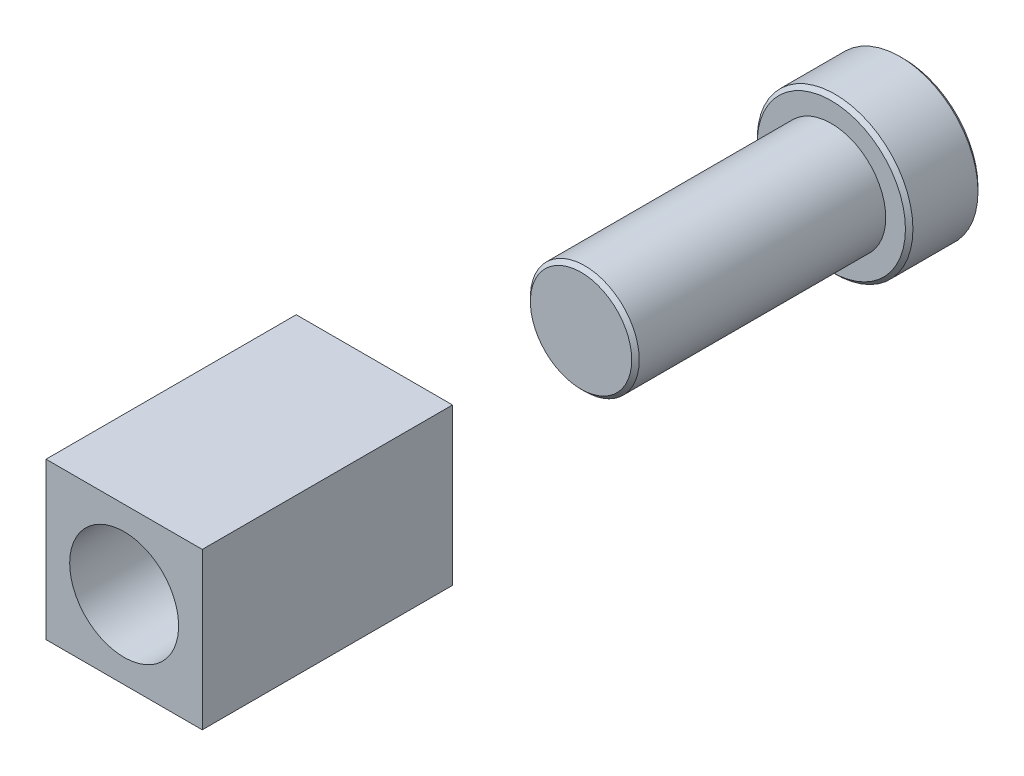
ISO-10303-21;
HEADER;
FILE_DESCRIPTION(('STEP AP214'),'2;1');
FILE_NAME('part.step','',(''),(''),'','','');
FILE_SCHEMA(('AUTOMOTIVE_DESIGN { 1 0 10303 214 1 1 1 1 }'));
ENDSEC;
DATA;
#1=APPLICATION_CONTEXT('core data for automotive mechanical design processes');
#2=APPLICATION_PROTOCOL_DEFINITION('international standard','automotive_design',2000,#1);
#3=PRODUCT_CONTEXT('',#1,'mechanical');
#4=PRODUCT('Part','Part','',(#3));
#5=PRODUCT_RELATED_PRODUCT_CATEGORY('part','',(#4));
#6=PRODUCT_DEFINITION_FORMATION('','',#4);
#7=PRODUCT_DEFINITION_CONTEXT('part definition',#1,'design');
#8=PRODUCT_DEFINITION('design','',#6,#7);
#9=PRODUCT_DEFINITION_SHAPE('','',#8);
#10=(LENGTH_UNIT() NAMED_UNIT(*) SI_UNIT(.MILLI.,.METRE.));
#11=(NAMED_UNIT(*) PLANE_ANGLE_UNIT() SI_UNIT($,.RADIAN.));
#12=(NAMED_UNIT(*) SI_UNIT($,.STERADIAN.) SOLID_ANGLE_UNIT());
#13=UNCERTAINTY_MEASURE_WITH_UNIT(LENGTH_MEASURE(1.E-05),#10,'distance_accuracy_value','');
#14=(GEOMETRIC_REPRESENTATION_CONTEXT(3) GLOBAL_UNCERTAINTY_ASSIGNED_CONTEXT((#13)) GLOBAL_UNIT_ASSIGNED_CONTEXT((#10,
#11,#12)) REPRESENTATION_CONTEXT('',''));
#15=CARTESIAN_POINT('',(0.,0.,0.));
#16=DIRECTION('',(0.,0.,1.));
#17=DIRECTION('',(1.,0.,0.));
#18=AXIS2_PLACEMENT_3D('',#15,#16,#17);
#19=CARTESIAN_POINT('',(-15.8613491960392,15.8613491960392,158.283276511442));
#20=DIRECTION('',(1.,0.,0.));
#21=DIRECTION('',(0.,1.,0.));
#22=AXIS2_PLACEMENT_3D('',#19,#20,#21);
#23=PLANE('',#22);
#24=DIRECTION('',(0.,-1.,0.));
#25=VECTOR('',#24,1.);
#26=CARTESIAN_POINT('',(-15.8613491960392,15.8613491960392,107.483276511442));
#27=LINE('',#26,#25);
#28=CARTESIAN_POINT('',(-15.8613491960392,15.8613491960392,107.483276511442));
#29=VERTEX_POINT('',#28);
#30=CARTESIAN_POINT('',(-15.8613491960392,-15.8613491960392,107.483276511442));
#31=VERTEX_POINT('',#30);
#32=EDGE_CURVE('E108',#29,#31,#27,.T.);
#33=ORIENTED_EDGE('',*,*,#32,.T.);
#34=DIRECTION('',(0.,0.,-1.));
#35=VECTOR('',#34,1.);
#36=CARTESIAN_POINT('',(-15.8613491960392,-15.8613491960392,158.283276511442));
#37=LINE('',#36,#35);
#38=CARTESIAN_POINT('',(-15.8613491960392,-15.8613491960392,158.283276511442));
#39=VERTEX_POINT('',#38);
#40=EDGE_CURVE('E12',#39,#31,#37,.T.);
#41=ORIENTED_EDGE('',*,*,#40,.F.);
#42=DIRECTION('',(0.,-1.,0.));
#43=VECTOR('',#42,1.);
#44=CARTESIAN_POINT('',(-15.8613491960392,15.8613491960392,158.283276511442));
#45=LINE('',#44,#43);
#46=CARTESIAN_POINT('',(-15.8613491960392,15.8613491960392,158.283276511442));
#47=VERTEX_POINT('',#46);
#48=EDGE_CURVE('E96',#47,#39,#45,.T.);
#49=ORIENTED_EDGE('',*,*,#48,.F.);
#50=DIRECTION('',(0.,0.,-1.));
#51=VECTOR('',#50,1.);
#52=CARTESIAN_POINT('',(-15.8613491960392,15.8613491960392,158.283276511442));
#53=LINE('',#52,#51);
#54=EDGE_CURVE('E104',#47,#29,#53,.T.);
#55=ORIENTED_EDGE('',*,*,#54,.T.);
#56=EDGE_LOOP('',(#33,#41,#49,#55));
#57=FACE_BOUND('',#56,.T.);
#58=ADVANCED_FACE('F45',(#57),#23,.F.);
#59=CARTESIAN_POINT('',(-15.8613491960392,-15.8613491960392,158.283276511442));
#60=DIRECTION('',(0.,1.,0.));
#61=DIRECTION('',(0.,0.,1.));
#62=AXIS2_PLACEMENT_3D('',#59,#60,#61);
#63=PLANE('',#62);
#64=DIRECTION('',(1.,0.,0.));
#65=VECTOR('',#64,1.);
#66=CARTESIAN_POINT('',(-15.8613491960392,-15.8613491960392,107.483276511442));
#67=LINE('',#66,#65);
#68=CARTESIAN_POINT('',(15.8613491960392,-15.8613491960392,107.483276511442));
#69=VERTEX_POINT('',#68);
#70=EDGE_CURVE('E100',#31,#69,#67,.T.);
#71=ORIENTED_EDGE('',*,*,#70,.T.);
#72=DIRECTION('',(0.,0.,-1.));
#73=VECTOR('',#72,1.);
#74=CARTESIAN_POINT('',(15.8613491960392,-15.8613491960392,158.283276511442));
#75=LINE('',#74,#73);
#76=CARTESIAN_POINT('',(15.8613491960392,-15.8613491960392,158.283276511442));
#77=VERTEX_POINT('',#76);
#78=EDGE_CURVE('E53',#77,#69,#75,.T.);
#79=ORIENTED_EDGE('',*,*,#78,.F.);
#80=DIRECTION('',(1.,0.,0.));
#81=VECTOR('',#80,1.);
#82=CARTESIAN_POINT('',(-15.8613491960392,-15.8613491960392,158.283276511442));
#83=LINE('',#82,#81);
#84=EDGE_CURVE('E91',#39,#77,#83,.T.);
#85=ORIENTED_EDGE('',*,*,#84,.F.);
#86=ORIENTED_EDGE('',*,*,#40,.T.);
#87=EDGE_LOOP('',(#71,#79,#85,#86));
#88=FACE_BOUND('',#87,.T.);
#89=ADVANCED_FACE('F99',(#88),#63,.F.);
#90=CARTESIAN_POINT('',(15.8613491960392,15.8613491960392,158.283276511442));
#91=DIRECTION('',(-1.,0.,0.));
#92=DIRECTION('',(0.,-1.,0.));
#93=AXIS2_PLACEMENT_3D('',#90,#91,#92);
#94=PLANE('',#93);
#95=DIRECTION('',(0.,1.,0.));
#96=VECTOR('',#95,1.);
#97=CARTESIAN_POINT('',(15.8613491960392,15.8613491960392,107.483276511442));
#98=LINE('',#97,#96);
#99=CARTESIAN_POINT('',(15.8613491960392,15.8613491960392,107.483276511442));
#100=VERTEX_POINT('',#99);
#101=EDGE_CURVE('E78',#69,#100,#98,.T.);
#102=ORIENTED_EDGE('',*,*,#101,.T.);
#103=DIRECTION('',(0.,0.,-1.));
#104=VECTOR('',#103,1.);
#105=CARTESIAN_POINT('',(15.8613491960392,15.8613491960392,158.283276511442));
#106=LINE('',#105,#104);
#107=CARTESIAN_POINT('',(15.8613491960392,15.8613491960392,158.283276511442));
#108=VERTEX_POINT('',#107);
#109=EDGE_CURVE('E101',#108,#100,#106,.T.);
#110=ORIENTED_EDGE('',*,*,#109,.F.);
#111=DIRECTION('',(0.,1.,0.));
#112=VECTOR('',#111,1.);
#113=CARTESIAN_POINT('',(15.8613491960392,15.8613491960392,158.283276511442));
#114=LINE('',#113,#112);
#115=EDGE_CURVE('E94',#77,#108,#114,.T.);
#116=ORIENTED_EDGE('',*,*,#115,.F.);
#117=ORIENTED_EDGE('',*,*,#78,.T.);
#118=EDGE_LOOP('',(#102,#110,#116,#117));
#119=FACE_BOUND('',#118,.T.);
#120=ADVANCED_FACE('F102',(#119),#94,.F.);
#121=CARTESIAN_POINT('',(-15.8613491960392,15.8613491960392,158.283276511442));
#122=DIRECTION('',(0.,-1.,0.));
#123=DIRECTION('',(0.,0.,-1.));
#124=AXIS2_PLACEMENT_3D('',#121,#122,#123);
#125=PLANE('',#124);
#126=DIRECTION('',(-1.,0.,0.));
#127=VECTOR('',#126,1.);
#128=CARTESIAN_POINT('',(-15.8613491960392,15.8613491960392,107.483276511442));
#129=LINE('',#128,#127);
#130=EDGE_CURVE('E84',#100,#29,#129,.T.);
#131=ORIENTED_EDGE('',*,*,#130,.T.);
#132=ORIENTED_EDGE('',*,*,#54,.F.);
#133=DIRECTION('',(-1.,0.,0.));
#134=VECTOR('',#133,1.);
#135=CARTESIAN_POINT('',(-15.8613491960392,15.8613491960392,158.283276511442));
#136=LINE('',#135,#134);
#137=EDGE_CURVE('E61',#108,#47,#136,.T.);
#138=ORIENTED_EDGE('',*,*,#137,.F.);
#139=ORIENTED_EDGE('',*,*,#109,.T.);
#140=EDGE_LOOP('',(#131,#132,#138,#139));
#141=FACE_BOUND('',#140,.T.);
#142=ADVANCED_FACE('F116',(#141),#125,.F.);
#143=CARTESIAN_POINT('',(0.,0.,158.283276511442));
#144=DIRECTION('',(0.,0.,1.));
#145=DIRECTION('',(1.,0.,0.));
#146=AXIS2_PLACEMENT_3D('',#143,#144,#145);
#147=PLANE('',#146);
#148=CARTESIAN_POINT('',(0.,0.,158.283276511442));
#149=DIRECTION('',(0.,0.,-1.));
#150=DIRECTION('',(-1.,0.,0.));
#151=AXIS2_PLACEMENT_3D('',#148,#149,#150);
#152=CIRCLE('',#151,11.05535);
#153=CARTESIAN_POINT('',(-11.05535,0.,158.283276511442));
#154=VERTEX_POINT('',#153);
#155=EDGE_CURVE('E111',#154,#154,#152,.T.);
#156=ORIENTED_EDGE('',*,*,#155,.T.);
#157=EDGE_LOOP('',(#156));
#158=FACE_BOUND('',#157,.T.);
#159=ORIENTED_EDGE('',*,*,#48,.T.);
#160=ORIENTED_EDGE('',*,*,#84,.T.);
#161=ORIENTED_EDGE('',*,*,#115,.T.);
#162=ORIENTED_EDGE('',*,*,#137,.T.);
#163=EDGE_LOOP('',(#159,#160,#161,#162));
#164=FACE_BOUND('',#163,.T.);
#165=ADVANCED_FACE('F92',(#158,#164),#147,.T.);
#166=CARTESIAN_POINT('',(0.,0.,107.483276511442));
#167=DIRECTION('',(0.,0.,1.));
#168=DIRECTION('',(1.,0.,0.));
#169=AXIS2_PLACEMENT_3D('',#166,#167,#168);
#170=PLANE('',#169);
#171=CARTESIAN_POINT('',(0.,0.,107.483276511442));
#172=DIRECTION('',(0.,0.,-1.));
#173=DIRECTION('',(-1.,0.,0.));
#174=AXIS2_PLACEMENT_3D('',#171,#172,#173);
#175=CIRCLE('',#174,11.05535);
#176=CARTESIAN_POINT('',(-11.05535,0.,107.483276511442));
#177=VERTEX_POINT('',#176);
#178=EDGE_CURVE('E122',#177,#177,#175,.T.);
#179=ORIENTED_EDGE('',*,*,#178,.F.);
#180=EDGE_LOOP('',(#179));
#181=FACE_BOUND('',#180,.T.);
#182=ORIENTED_EDGE('',*,*,#32,.F.);
#183=ORIENTED_EDGE('',*,*,#130,.F.);
#184=ORIENTED_EDGE('',*,*,#101,.F.);
#185=ORIENTED_EDGE('',*,*,#70,.F.);
#186=EDGE_LOOP('',(#182,#183,#184,#185));
#187=FACE_BOUND('',#186,.T.);
#188=ADVANCED_FACE('F119',(#181,#187),#170,.F.);
#189=CARTESIAN_POINT('',(0.,0.,158.283276511442));
#190=DIRECTION('',(0.,0.,-1.));
#191=DIRECTION('',(-1.,0.,0.));
#192=AXIS2_PLACEMENT_3D('',#189,#190,#191);
#193=CYLINDRICAL_SURFACE('',#192,11.05535);
#194=ORIENTED_EDGE('',*,*,#155,.F.);
#195=EDGE_LOOP('',(#194));
#196=FACE_BOUND('',#195,.T.);
#197=ORIENTED_EDGE('',*,*,#178,.T.);
#198=EDGE_LOOP('',(#197));
#199=FACE_BOUND('',#198,.T.);
#200=ADVANCED_FACE('F129',(#196,#199),#193,.F.);
#201=CLOSED_SHELL('',(#58,#89,#120,#142,#165,#188,#200));
#202=MANIFOLD_SOLID_BREP('B2',#201);
#203=CARTESIAN_POINT('',(0.,0.,14.732));
#204=DIRECTION('',(0.,0.,1.));
#205=DIRECTION('',(1.,0.,0.));
#206=AXIS2_PLACEMENT_3D('',#203,#204,#205);
#207=PLANE('',#206);
#208=CARTESIAN_POINT('',(0.,0.,14.732));
#209=DIRECTION('',(0.,0.,1.));
#210=DIRECTION('',(1.,0.,0.));
#211=AXIS2_PLACEMENT_3D('',#208,#209,#210);
#212=CIRCLE('',#211,15.0495);
#213=CARTESIAN_POINT('',(15.0495,0.,14.732));
#214=VERTEX_POINT('',#213);
#215=EDGE_CURVE('E201',#214,#214,#212,.T.);
#216=ORIENTED_EDGE('',*,*,#215,.T.);
#217=EDGE_LOOP('',(#216));
#218=FACE_BOUND('',#217,.T.);
#219=CARTESIAN_POINT('',(0.,0.,14.732));
#220=DIRECTION('',(0.,0.,1.));
#221=DIRECTION('',(1.,0.,0.));
#222=AXIS2_PLACEMENT_3D('',#219,#220,#221);
#223=CIRCLE('',#222,11.049);
#224=CARTESIAN_POINT('',(11.049,0.,14.732));
#225=VERTEX_POINT('',#224);
#226=EDGE_CURVE('E216',#225,#225,#223,.T.);
#227=ORIENTED_EDGE('',*,*,#226,.F.);
#228=EDGE_LOOP('',(#227));
#229=FACE_BOUND('',#228,.T.);
#230=ADVANCED_FACE('F190',(#218,#229),#207,.T.);
#231=CARTESIAN_POINT('',(0.,0.,14.732));
#232=DIRECTION('',(0.,0.,-1.));
#233=DIRECTION('',(-1.,0.,0.));
#234=AXIS2_PLACEMENT_3D('',#231,#232,#233);
#235=CYLINDRICAL_SURFACE('',#234,15.8115);
#236=CARTESIAN_POINT('',(0.,0.,0.761999999999988));
#237=DIRECTION('',(0.,0.,1.));
#238=DIRECTION('',(1.,0.,0.));
#239=AXIS2_PLACEMENT_3D('',#236,#237,#238);
#240=CIRCLE('',#239,15.8115);
#241=CARTESIAN_POINT('',(15.8115,0.,0.761999999999988));
#242=VERTEX_POINT('',#241);
#243=EDGE_CURVE('E210',#242,#242,#240,.T.);
#244=ORIENTED_EDGE('',*,*,#243,.T.);
#245=EDGE_LOOP('',(#244));
#246=FACE_BOUND('',#245,.T.);
#247=CARTESIAN_POINT('',(0.,0.,13.97));
#248=DIRECTION('',(0.,0.,1.));
#249=DIRECTION('',(1.,0.,0.));
#250=AXIS2_PLACEMENT_3D('',#247,#248,#249);
#251=CIRCLE('',#250,15.8115);
#252=CARTESIAN_POINT('',(15.8115,0.,13.97));
#253=VERTEX_POINT('',#252);
#254=EDGE_CURVE('E213',#253,#253,#251,.F.);
#255=ORIENTED_EDGE('',*,*,#254,.T.);
#256=EDGE_LOOP('',(#255));
#257=FACE_BOUND('',#256,.T.);
#258=ADVANCED_FACE('F223',(#246,#257),#235,.T.);
#259=CARTESIAN_POINT('',(0.,0.,0.));
#260=DIRECTION('',(0.,0.,1.));
#261=DIRECTION('',(1.,0.,0.));
#262=AXIS2_PLACEMENT_3D('',#259,#260,#261);
#263=PLANE('',#262);
#264=CARTESIAN_POINT('',(0.,0.,0.));
#265=DIRECTION('',(0.,0.,1.));
#266=DIRECTION('',(1.,0.,0.));
#267=AXIS2_PLACEMENT_3D('',#264,#265,#266);
#268=CIRCLE('',#267,15.0495);
#269=CARTESIAN_POINT('',(15.0495,0.,0.));
#270=VERTEX_POINT('',#269);
#271=EDGE_CURVE('E205',#270,#270,#268,.F.);
#272=ORIENTED_EDGE('',*,*,#271,.T.);
#273=EDGE_LOOP('',(#272));
#274=FACE_BOUND('',#273,.T.);
#275=ADVANCED_FACE('F229',(#274),#263,.F.);
#276=CARTESIAN_POINT('',(0.,0.,65.532));
#277=DIRECTION('',(0.,0.,-1.));
#278=DIRECTION('',(-1.,0.,0.));
#279=AXIS2_PLACEMENT_3D('',#276,#277,#278);
#280=CYLINDRICAL_SURFACE('',#279,11.049);
#281=CARTESIAN_POINT('',(0.,0.,64.77));
#282=DIRECTION('',(0.,0.,1.));
#283=DIRECTION('',(1.,0.,0.));
#284=AXIS2_PLACEMENT_3D('',#281,#282,#283);
#285=CIRCLE('',#284,11.049);
#286=CARTESIAN_POINT('',(11.049,0.,64.77));
#287=VERTEX_POINT('',#286);
#288=EDGE_CURVE('E44',#287,#287,#285,.F.);
#289=ORIENTED_EDGE('',*,*,#288,.T.);
#290=EDGE_LOOP('',(#289));
#291=FACE_BOUND('',#290,.T.);
#292=ORIENTED_EDGE('',*,*,#226,.T.);
#293=EDGE_LOOP('',(#292));
#294=FACE_BOUND('',#293,.T.);
#295=ADVANCED_FACE('F220',(#291,#294),#280,.T.);
#296=CARTESIAN_POINT('',(0.,0.,65.532));
#297=DIRECTION('',(0.,0.,1.));
#298=DIRECTION('',(1.,0.,0.));
#299=AXIS2_PLACEMENT_3D('',#296,#297,#298);
#300=PLANE('',#299);
#301=CARTESIAN_POINT('',(0.,0.,65.532));
#302=DIRECTION('',(0.,0.,1.));
#303=DIRECTION('',(1.,0.,0.));
#304=AXIS2_PLACEMENT_3D('',#301,#302,#303);
#305=CIRCLE('',#304,10.287);
#306=CARTESIAN_POINT('',(10.287,0.,65.532));
#307=VERTEX_POINT('',#306);
#308=EDGE_CURVE('E197',#307,#307,#305,.T.);
#309=ORIENTED_EDGE('',*,*,#308,.T.);
#310=EDGE_LOOP('',(#309));
#311=FACE_BOUND('',#310,.T.);
#312=ADVANCED_FACE('F241',(#311),#300,.T.);
#313=CARTESIAN_POINT('',(0.,0.,0.761999999999988));
#314=DIRECTION('',(0.,0.,1.));
#315=DIRECTION('',(1.,0.,0.));
#316=AXIS2_PLACEMENT_3D('',#313,#314,#315);
#317=CONICAL_SURFACE('',#316,15.8115,0.785398163397453);
#318=CARTESIAN_POINT('',(15.0495,0.,0.));
#319=CARTESIAN_POINT('',(15.0574375,0.,0.00793749999999982));
#320=CARTESIAN_POINT('',(15.065375,0.,0.0158749999999997));
#321=CARTESIAN_POINT('',(15.08125,0.,0.0317499999999994));
#322=CARTESIAN_POINT('',(15.0891875,0.,0.0396874999999992));
#323=CARTESIAN_POINT('',(15.1050625,0.,0.0555624999999991));
#324=CARTESIAN_POINT('',(15.113,0.,0.0634999999999991));
#325=CARTESIAN_POINT('',(15.128875,0.,0.0793749999999988));
#326=CARTESIAN_POINT('',(15.1368125,0.,0.0873124999999985));
#327=CARTESIAN_POINT('',(15.1526875,0.,0.103187499999998));
#328=CARTESIAN_POINT('',(15.160625,0.,0.111124999999998));
#329=CARTESIAN_POINT('',(15.1765,0.,0.126999999999998));
#330=CARTESIAN_POINT('',(15.1844375,0.,0.134937499999998));
#331=CARTESIAN_POINT('',(15.2003125,0.,0.150812499999998));
#332=CARTESIAN_POINT('',(15.20825,0.,0.158749999999997));
#333=CARTESIAN_POINT('',(15.224125,0.,0.174624999999997));
#334=CARTESIAN_POINT('',(15.2320625,0.,0.182562499999997));
#335=CARTESIAN_POINT('',(15.2479375,0.,0.198437499999997));
#336=CARTESIAN_POINT('',(15.255875,0.,0.206374999999997));
#337=CARTESIAN_POINT('',(15.27175,0.,0.222249999999996));
#338=CARTESIAN_POINT('',(15.2796875,0.,0.230187499999996));
#339=CARTESIAN_POINT('',(15.2955625,0.,0.246062499999996));
#340=CARTESIAN_POINT('',(15.3035,0.,0.253999999999996));
#341=CARTESIAN_POINT('',(15.319375,0.,0.269874999999996));
#342=CARTESIAN_POINT('',(15.3273125,0.,0.277812499999996));
#343=CARTESIAN_POINT('',(15.3431875,0.,0.293687499999995));
#344=CARTESIAN_POINT('',(15.351125,0.,0.301624999999995));
#345=CARTESIAN_POINT('',(15.367,0.,0.317499999999995));
#346=CARTESIAN_POINT('',(15.3749375,0.,0.325437499999995));
#347=CARTESIAN_POINT('',(15.3908125,0.,0.341312499999995));
#348=CARTESIAN_POINT('',(15.39875,0.,0.349249999999995));
#349=CARTESIAN_POINT('',(15.414625,0.,0.365124999999994));
#350=CARTESIAN_POINT('',(15.4225625,0.,0.373062499999994));
#351=CARTESIAN_POINT('',(15.4384375,0.,0.388937499999994));
#352=CARTESIAN_POINT('',(15.446375,0.,0.396874999999994));
#353=CARTESIAN_POINT('',(15.46225,0.,0.412749999999994));
#354=CARTESIAN_POINT('',(15.4701875,0.,0.420687499999993));
#355=CARTESIAN_POINT('',(15.4860625,0.,0.436562499999993));
#356=CARTESIAN_POINT('',(15.494,0.,0.444499999999993));
#357=CARTESIAN_POINT('',(15.509875,0.,0.460374999999993));
#358=CARTESIAN_POINT('',(15.5178125,0.,0.468312499999993));
#359=CARTESIAN_POINT('',(15.5336875,0.,0.484187499999992));
#360=CARTESIAN_POINT('',(15.541625,0.,0.492124999999992));
#361=CARTESIAN_POINT('',(15.5575,0.,0.507999999999992));
#362=CARTESIAN_POINT('',(15.5654375,0.,0.515937499999992));
#363=CARTESIAN_POINT('',(15.5813125,0.,0.531812499999992));
#364=CARTESIAN_POINT('',(15.58925,0.,0.539749999999992));
#365=CARTESIAN_POINT('',(15.605125,0.,0.555624999999991));
#366=CARTESIAN_POINT('',(15.6130625,0.,0.563562499999992));
#367=CARTESIAN_POINT('',(15.6289375,0.,0.579437499999991));
#368=CARTESIAN_POINT('',(15.636875,0.,0.587374999999991));
#369=CARTESIAN_POINT('',(15.65275,0.,0.60324999999999));
#370=CARTESIAN_POINT('',(15.6606875,0.,0.611187499999991));
#371=CARTESIAN_POINT('',(15.6765625,0.,0.627062499999991));
#372=CARTESIAN_POINT('',(15.6845,0.,0.63499999999999));
#373=CARTESIAN_POINT('',(15.700375,0.,0.65087499999999));
#374=CARTESIAN_POINT('',(15.7083125,0.,0.658812499999989));
#375=CARTESIAN_POINT('',(15.7241875,0.,0.674687499999989));
#376=CARTESIAN_POINT('',(15.732125,0.,0.68262499999999));
#377=CARTESIAN_POINT('',(15.748,0.,0.698499999999989));
#378=CARTESIAN_POINT('',(15.7559375,0.,0.706437499999989));
#379=CARTESIAN_POINT('',(15.7718125,0.,0.722312499999988));
#380=CARTESIAN_POINT('',(15.77975,0.,0.730249999999989));
#381=CARTESIAN_POINT('',(15.795625,0.,0.746124999999989));
#382=CARTESIAN_POINT('',(15.8035625,0.,0.754062499999989));
#383=CARTESIAN_POINT('',(15.8115,0.,0.761999999999988));
#384=B_SPLINE_CURVE_WITH_KNOTS('',3,(#318,#319,#320,#321,#322,#323,#324,#325,#326,#327,#328,
#329,#330,#331,#332,#333,#334,#335,#336,#337,#338,#339,#340,#341,#342,#343,#344,#345,#346,#347,
#348,#349,#350,#351,#352,#353,#354,#355,#356,#357,#358,#359,#360,#361,#362,#363,#364,#365,#366,
#367,#368,#369,#370,#371,#372,#373,#374,#375,#376,#377,#378,#379,#380,#381,#382,#383),
.UNSPECIFIED.,.F.,.F.,(4,2,2,2,2,2,2,2,2,2,2,2,2,2,2,2,2,2,2,2,2,2,2,2,2,2,2,2,2,2,2,2,4),(0.,
0.0336759604540087,0.0673519209080175,0.101027881362026,0.134703841816036,0.168379802270045,
0.202055762724054,0.235731723178062,0.269407683632071,0.303083644086081,0.33675960454009,
0.370435564994099,0.404111525448107,0.437787485902116,0.471463446356126,0.505139406810135,
0.538815367264143,0.572491327718152,0.606167288172161,0.639843248626169,0.673519209080179,
0.707195169534188,0.740871129988197,0.774547090442205,0.808223050896214,0.841899011350224,
0.875574971804232,0.909250932258242,0.942926892712252,0.976602853166259,1.01027881362027,
1.04395477407428,1.07763073452829),.UNSPECIFIED.);
#385=EDGE_CURVE('BSEAM238',#270,#242,#384,.T.);
#386=ORIENTED_EDGE('',*,*,#271,.F.);
#387=ORIENTED_EDGE('',*,*,#243,.F.);
#388=ORIENTED_EDGE('',*,*,#385,.T.);
#389=ORIENTED_EDGE('',*,*,#385,.F.);
#390=EDGE_LOOP('',(#386,#388,#387,#389));
#391=FACE_BOUND('',#390,.T.);
#392=ADVANCED_FACE('F238',(#391),#317,.T.);
#393=CARTESIAN_POINT('',(0.,0.,14.732));
#394=DIRECTION('',(0.,0.,-1.));
#395=DIRECTION('',(-1.,0.,0.));
#396=AXIS2_PLACEMENT_3D('',#393,#394,#395);
#397=CONICAL_SURFACE('',#396,15.0495,0.785398163397453);
#398=ORIENTED_EDGE('',*,*,#254,.F.);
#399=EDGE_LOOP('',(#398));
#400=FACE_BOUND('',#399,.T.);
#401=ORIENTED_EDGE('',*,*,#215,.F.);
#402=EDGE_LOOP('',(#401));
#403=FACE_BOUND('',#402,.T.);
#404=ADVANCED_FACE('F240',(#400,#403),#397,.T.);
#405=CARTESIAN_POINT('',(0.,0.,65.532));
#406=DIRECTION('',(0.,0.,-1.));
#407=DIRECTION('',(-1.,0.,0.));
#408=AXIS2_PLACEMENT_3D('',#405,#406,#407);
#409=CONICAL_SURFACE('',#408,10.287,0.78539816339746);
#410=ORIENTED_EDGE('',*,*,#288,.F.);
#411=EDGE_LOOP('',(#410));
#412=FACE_BOUND('',#411,.T.);
#413=ORIENTED_EDGE('',*,*,#308,.F.);
#414=EDGE_LOOP('',(#413));
#415=FACE_BOUND('',#414,.T.);
#416=ADVANCED_FACE('F192',(#412,#415),#409,.T.);
#417=CLOSED_SHELL('',(#230,#258,#275,#295,#312,#392,#404,#416));
#418=MANIFOLD_SOLID_BREP('B6',#417);
#419=ADVANCED_BREP_SHAPE_REPRESENTATION('',(#18,#202,#418),#14);
#420=SHAPE_DEFINITION_REPRESENTATION(#9,#419);
ENDSEC;
END-ISO-10303-21;
